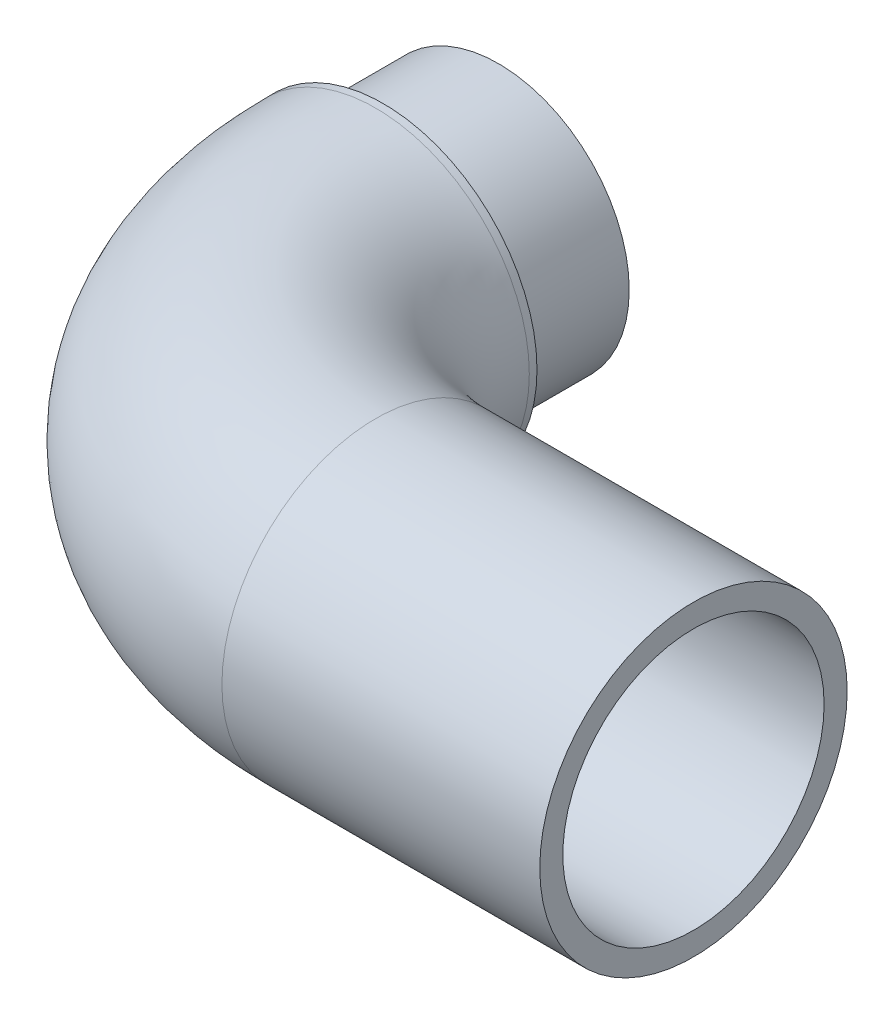
ISO-10303-21;
HEADER;
FILE_DESCRIPTION(('STEP AP214'),'2;1');
FILE_NAME('part.step','',(''),(''),'','','');
FILE_SCHEMA(('AUTOMOTIVE_DESIGN { 1 0 10303 214 1 1 1 1 }'));
ENDSEC;
DATA;
#1=APPLICATION_CONTEXT('core data for automotive mechanical design processes');
#2=APPLICATION_PROTOCOL_DEFINITION('international standard','automotive_design',2000,#1);
#3=PRODUCT_CONTEXT('',#1,'mechanical');
#4=PRODUCT('Part','Part','',(#3));
#5=PRODUCT_RELATED_PRODUCT_CATEGORY('part','',(#4));
#6=PRODUCT_DEFINITION_FORMATION('','',#4);
#7=PRODUCT_DEFINITION_CONTEXT('part definition',#1,'design');
#8=PRODUCT_DEFINITION('design','',#6,#7);
#9=PRODUCT_DEFINITION_SHAPE('','',#8);
#10=(LENGTH_UNIT() NAMED_UNIT(*) SI_UNIT(.MILLI.,.METRE.));
#11=(NAMED_UNIT(*) PLANE_ANGLE_UNIT() SI_UNIT($,.RADIAN.));
#12=(NAMED_UNIT(*) SI_UNIT($,.STERADIAN.) SOLID_ANGLE_UNIT());
#13=UNCERTAINTY_MEASURE_WITH_UNIT(LENGTH_MEASURE(1.E-05),#10,'distance_accuracy_value','');
#14=(GEOMETRIC_REPRESENTATION_CONTEXT(3) GLOBAL_UNCERTAINTY_ASSIGNED_CONTEXT((#13)) GLOBAL_UNIT_ASSIGNED_CONTEXT((#10,
#11,#12)) REPRESENTATION_CONTEXT('',''));
#15=CARTESIAN_POINT('',(0.,0.,0.));
#16=DIRECTION('',(0.,0.,1.));
#17=DIRECTION('',(1.,0.,0.));
#18=AXIS2_PLACEMENT_3D('',#15,#16,#17);
#19=CARTESIAN_POINT('',(0.,0.,15.));
#20=DIRECTION('',(0.,0.,-1.));
#21=DIRECTION('',(-1.,0.,0.));
#22=AXIS2_PLACEMENT_3D('',#19,#20,#21);
#23=CYLINDRICAL_SURFACE('',#22,17.);
#24=CARTESIAN_POINT('',(0.,0.,15.));
#25=DIRECTION('',(0.,0.,1.));
#26=DIRECTION('',(1.,0.,0.));
#27=AXIS2_PLACEMENT_3D('',#24,#25,#26);
#28=CIRCLE('',#27,17.);
#29=CARTESIAN_POINT('',(17.,0.,15.));
#30=VERTEX_POINT('',#29);
#31=EDGE_CURVE('E10',#30,#30,#28,.T.);
#32=ORIENTED_EDGE('',*,*,#31,.F.);
#33=EDGE_LOOP('',(#32));
#34=FACE_BOUND('',#33,.T.);
#35=CARTESIAN_POINT('',(0.,0.,0.));
#36=DIRECTION('',(0.,0.,1.));
#37=DIRECTION('',(1.,0.,0.));
#38=AXIS2_PLACEMENT_3D('',#35,#36,#37);
#39=CIRCLE('',#38,17.);
#40=CARTESIAN_POINT('',(17.,0.,0.));
#41=VERTEX_POINT('',#40);
#42=EDGE_CURVE('E36',#41,#41,#39,.T.);
#43=ORIENTED_EDGE('',*,*,#42,.T.);
#44=EDGE_LOOP('',(#43));
#45=FACE_BOUND('',#44,.T.);
#46=ADVANCED_FACE('F33',(#34,#45),#23,.T.);
#47=CARTESIAN_POINT('',(0.,0.,0.));
#48=DIRECTION('',(0.,0.,1.));
#49=DIRECTION('',(1.,0.,0.));
#50=AXIS2_PLACEMENT_3D('',#47,#48,#49);
#51=PLANE('',#50);
#52=ORIENTED_EDGE('',*,*,#42,.F.);
#53=EDGE_LOOP('',(#52));
#54=FACE_BOUND('',#53,.T.);
#55=ADVANCED_FACE('F93',(#54),#51,.F.);
#56=CARTESIAN_POINT('',(0.,0.,15.));
#57=DIRECTION('',(0.,0.,1.));
#58=DIRECTION('',(1.,0.,0.));
#59=AXIS2_PLACEMENT_3D('',#56,#57,#58);
#60=PLANE('',#59);
#61=ORIENTED_EDGE('',*,*,#31,.T.);
#62=EDGE_LOOP('',(#61));
#63=FACE_BOUND('',#62,.T.);
#64=CARTESIAN_POINT('',(0.,0.,15.));
#65=DIRECTION('',(0.,0.,1.));
#66=DIRECTION('',(1.,0.,0.));
#67=AXIS2_PLACEMENT_3D('',#64,#65,#66);
#68=CIRCLE('',#67,20.);
#69=CARTESIAN_POINT('',(20.,0.,15.));
#70=VERTEX_POINT('',#69);
#71=EDGE_CURVE('E53',#70,#70,#68,.T.);
#72=ORIENTED_EDGE('',*,*,#71,.F.);
#73=EDGE_LOOP('',(#72));
#74=FACE_BOUND('',#73,.T.);
#75=ADVANCED_FACE('F98',(#63,#74),#60,.F.);
#76=CARTESIAN_POINT('',(76.3607086726985,0.,51.));
#77=DIRECTION('',(1.,0.,0.));
#78=DIRECTION('',(0.,0.,-1.));
#79=AXIS2_PLACEMENT_3D('',#76,#77,#78);
#80=PLANE('',#79);
#81=CARTESIAN_POINT('',(76.3607086726985,0.,51.));
#82=DIRECTION('',(1.,0.,0.));
#83=DIRECTION('',(0.,0.,-1.));
#84=AXIS2_PLACEMENT_3D('',#81,#82,#83);
#85=CIRCLE('',#84,17.);
#86=CARTESIAN_POINT('',(76.3607086726985,0.,34.));
#87=VERTEX_POINT('',#86);
#88=EDGE_CURVE('E66',#87,#87,#85,.T.);
#89=ORIENTED_EDGE('',*,*,#88,.F.);
#90=EDGE_LOOP('',(#89));
#91=FACE_BOUND('',#90,.T.);
#92=CARTESIAN_POINT('',(76.3607086726985,0.,51.));
#93=DIRECTION('',(1.,0.,0.));
#94=DIRECTION('',(0.,0.,-1.));
#95=AXIS2_PLACEMENT_3D('',#92,#93,#94);
#96=CIRCLE('',#95,20.);
#97=CARTESIAN_POINT('',(76.3607086726985,0.,31.));
#98=VERTEX_POINT('',#97);
#99=EDGE_CURVE('E43',#98,#98,#96,.T.);
#100=ORIENTED_EDGE('',*,*,#99,.T.);
#101=EDGE_LOOP('',(#100));
#102=FACE_BOUND('',#101,.T.);
#103=ADVANCED_FACE('F106',(#91,#102),#80,.T.);
#104=CARTESIAN_POINT('',(0.,0.,15.));
#105=DIRECTION('',(0.,0.,1.));
#106=DIRECTION('',(1.,0.,0.));
#107=AXIS2_PLACEMENT_3D('',#104,#105,#106);
#108=CYLINDRICAL_SURFACE('',#107,20.);
#109=CARTESIAN_POINT('',(0.,0.,16.));
#110=DIRECTION('',(0.,0.,1.));
#111=DIRECTION('',(1.,0.,0.));
#112=AXIS2_PLACEMENT_3D('',#109,#110,#111);
#113=CIRCLE('',#112,20.);
#114=CARTESIAN_POINT('',(-20.,0.,16.));
#115=VERTEX_POINT('',#114);
#116=EDGE_CURVE('E50',#115,#115,#113,.T.);
#117=ORIENTED_EDGE('',*,*,#116,.F.);
#118=EDGE_LOOP('',(#117));
#119=FACE_BOUND('',#118,.T.);
#120=ORIENTED_EDGE('',*,*,#71,.T.);
#121=EDGE_LOOP('',(#120));
#122=FACE_BOUND('',#121,.T.);
#123=ADVANCED_FACE('F117',(#119,#122),#108,.T.);
#124=CARTESIAN_POINT('',(35.,0.,16.));
#125=DIRECTION('',(0.,1.,0.));
#126=DIRECTION('',(0.,0.,1.));
#127=AXIS2_PLACEMENT_3D('',#124,#125,#126);
#128=TOROIDAL_SURFACE('',#127,35.,20.);
#129=CARTESIAN_POINT('',(35.,0.,51.));
#130=DIRECTION('',(1.,0.,0.));
#131=DIRECTION('',(0.,0.,-1.));
#132=AXIS2_PLACEMENT_3D('',#129,#130,#131);
#133=CIRCLE('',#132,20.);
#134=CARTESIAN_POINT('',(35.,0.,71.));
#135=VERTEX_POINT('',#134);
#136=EDGE_CURVE('E47',#135,#135,#133,.T.);
#137=CARTESIAN_POINT('',(35.,0.,16.));
#138=DIRECTION('',(0.,1.,0.));
#139=DIRECTION('',(0.,0.,1.));
#140=AXIS2_PLACEMENT_3D('',#137,#138,#139);
#141=CIRCLE('',#140,55.);
#142=EDGE_CURVE('',#115,#135,#141,.T.);
#143=ORIENTED_EDGE('',*,*,#116,.T.);
#144=ORIENTED_EDGE('',*,*,#136,.F.);
#145=ORIENTED_EDGE('',*,*,#142,.T.);
#146=ORIENTED_EDGE('',*,*,#142,.F.);
#147=EDGE_LOOP('',(#143,#145,#144,#146));
#148=FACE_BOUND('',#147,.T.);
#149=ADVANCED_FACE('F109',(#148),#128,.T.);
#150=CARTESIAN_POINT('',(35.,0.,51.));
#151=DIRECTION('',(1.,0.,0.));
#152=DIRECTION('',(0.,0.,-1.));
#153=AXIS2_PLACEMENT_3D('',#150,#151,#152);
#154=CYLINDRICAL_SURFACE('',#153,20.);
#155=ORIENTED_EDGE('',*,*,#99,.F.);
#156=EDGE_LOOP('',(#155));
#157=FACE_BOUND('',#156,.T.);
#158=ORIENTED_EDGE('',*,*,#136,.T.);
#159=EDGE_LOOP('',(#158));
#160=FACE_BOUND('',#159,.T.);
#161=ADVANCED_FACE('F100',(#157,#160),#154,.T.);
#162=CARTESIAN_POINT('',(0.,0.,15.));
#163=DIRECTION('',(0.,0.,-1.));
#164=DIRECTION('',(-1.,0.,0.));
#165=AXIS2_PLACEMENT_3D('',#162,#163,#164);
#166=CYLINDRICAL_SURFACE('',#165,14.);
#167=CARTESIAN_POINT('',(0.,0.,18.));
#168=DIRECTION('',(0.,0.,1.));
#169=DIRECTION('',(1.,0.,0.));
#170=AXIS2_PLACEMENT_3D('',#167,#168,#169);
#171=CIRCLE('',#170,14.);
#172=CARTESIAN_POINT('',(14.,0.,18.));
#173=VERTEX_POINT('',#172);
#174=EDGE_CURVE('E56',#173,#173,#171,.T.);
#175=ORIENTED_EDGE('',*,*,#174,.T.);
#176=EDGE_LOOP('',(#175));
#177=FACE_BOUND('',#176,.T.);
#178=CARTESIAN_POINT('',(0.,0.,3.));
#179=DIRECTION('',(0.,0.,1.));
#180=DIRECTION('',(1.,0.,0.));
#181=AXIS2_PLACEMENT_3D('',#178,#179,#180);
#182=CIRCLE('',#181,14.);
#183=CARTESIAN_POINT('',(14.,0.,3.));
#184=VERTEX_POINT('',#183);
#185=EDGE_CURVE('E131',#184,#184,#182,.T.);
#186=ORIENTED_EDGE('',*,*,#185,.F.);
#187=EDGE_LOOP('',(#186));
#188=FACE_BOUND('',#187,.T.);
#189=ADVANCED_FACE('F90',(#177,#188),#166,.F.);
#190=CARTESIAN_POINT('',(0.,0.,3.));
#191=DIRECTION('',(0.,0.,1.));
#192=DIRECTION('',(1.,0.,0.));
#193=AXIS2_PLACEMENT_3D('',#190,#191,#192);
#194=PLANE('',#193);
#195=ORIENTED_EDGE('',*,*,#185,.T.);
#196=EDGE_LOOP('',(#195));
#197=FACE_BOUND('',#196,.T.);
#198=ADVANCED_FACE('F77',(#197),#194,.T.);
#199=CARTESIAN_POINT('',(0.,0.,18.));
#200=DIRECTION('',(0.,0.,1.));
#201=DIRECTION('',(1.,0.,0.));
#202=AXIS2_PLACEMENT_3D('',#199,#200,#201);
#203=PLANE('',#202);
#204=ORIENTED_EDGE('',*,*,#174,.F.);
#205=EDGE_LOOP('',(#204));
#206=FACE_BOUND('',#205,.T.);
#207=CARTESIAN_POINT('',(-10.6304352115561,-13.2310431459477,18.));
#208=CARTESIAN_POINT('',(-11.0022796488907,-12.9313478178478,18.));
#209=CARTESIAN_POINT('',(-11.3614449289228,-12.616016497693,18.));
#210=CARTESIAN_POINT('',(-12.0520844091158,-11.9561395098404,18.));
#211=CARTESIAN_POINT('',(-12.3835513717343,-11.6115862535754,18.));
#212=CARTESIAN_POINT('',(-13.0166237785163,-10.8954341590572,18.));
#213=CARTESIAN_POINT('',(-13.3181969768725,-10.5238068501056,18.));
#214=CARTESIAN_POINT('',(-13.8889742552831,-9.75639886922899,18.));
#215=CARTESIAN_POINT('',(-14.1581784710735,-9.36061829859853,18.));
#216=CARTESIAN_POINT('',(-14.5361435678762,-8.75115798258264,18.));
#217=CARTESIAN_POINT('',(-14.6578193872436,-8.54538411656839,18.));
#218=CARTESIAN_POINT('',(-14.892356743432,-8.12894229343867,18.));
#219=CARTESIAN_POINT('',(-15.0052205247882,-7.91827560044147,18.));
#220=CARTESIAN_POINT('',(-15.3303480218884,-7.27936798856905,18.));
#221=CARTESIAN_POINT('',(-15.5291678383327,-6.84418736309123,18.));
#222=CARTESIAN_POINT('',(-15.8893453762508,-5.95878435063019,18.));
#223=CARTESIAN_POINT('',(-16.0507125488799,-5.50856579133763,18.));
#224=CARTESIAN_POINT('',(-16.3349361174995,-4.59611741316506,18.));
#225=CARTESIAN_POINT('',(-16.4577926752204,-4.13388764473651,18.));
#226=CARTESIAN_POINT('',(-16.6640757408006,-3.20087112935778,18.));
#227=CARTESIAN_POINT('',(-16.7475148191758,-2.73008716020767,18.));
#228=CARTESIAN_POINT('',(-16.8744286985946,-1.78316134702246,18.));
#229=CARTESIAN_POINT('',(-16.9179034703545,-1.30701949906167,18.));
#230=CARTESIAN_POINT('',(-16.9645785835174,-0.352748601741941,18.));
#231=CARTESIAN_POINT('',(-16.9677774439148,0.12538052004534,18.));
#232=CARTESIAN_POINT('',(-16.9338742893181,1.08020775657851,18.));
#233=CARTESIAN_POINT('',(-16.8967722857268,1.55690587172925,18.));
#234=CARTESIAN_POINT('',(-16.7825465680271,2.50536010700927,18.));
#235=CARTESIAN_POINT('',(-16.7054329921555,2.97711744816763,18.));
#236=CARTESIAN_POINT('',(-16.5117398124711,3.91245927806366,18.));
#237=CARTESIAN_POINT('',(-16.3951602163935,4.37604376840314,18.));
#238=CARTESIAN_POINT('',(-16.12336645798,5.29174412967871,18.));
#239=CARTESIAN_POINT('',(-15.9681523886659,5.7438600282253,18.));
#240=CARTESIAN_POINT('',(-15.6201959106432,6.63341221985077,18.));
#241=CARTESIAN_POINT('',(-15.4274534962974,7.0708485107246,18.));
#242=CARTESIAN_POINT('',(-15.0057907144271,7.92798191068804,18.));
#243=CARTESIAN_POINT('',(-14.7768663740599,8.34767706534629,18.));
#244=CARTESIAN_POINT('',(-14.2844863025551,9.16629736751273,18.));
#245=CARTESIAN_POINT('',(-14.0210305721454,9.5652225154586,18.));
#246=CARTESIAN_POINT('',(-13.461464733903,10.33947195346,18.));
#247=CARTESIAN_POINT('',(-13.1653546629316,10.714796270156,18.));
#248=CARTESIAN_POINT('',(-12.5425883065919,11.4391837468995,18.));
#249=CARTESIAN_POINT('',(-12.2159320100499,11.7882468973406,18.));
#250=CARTESIAN_POINT('',(-11.5342406807144,12.4577942182799,18.));
#251=CARTESIAN_POINT('',(-11.1791926237872,12.7782651284059,18.));
#252=CARTESIAN_POINT('',(-10.4433769071685,13.3881776960252,18.));
#253=CARTESIAN_POINT('',(-10.0626092426942,13.6776193477483,18.));
#254=CARTESIAN_POINT('',(-9.27806233711038,14.223427770728,18.));
#255=CARTESIAN_POINT('',(-8.87428302747451,14.4797944434833,18.));
#256=CARTESIAN_POINT('',(-8.04658466642986,14.9576426907989,18.));
#257=CARTESIAN_POINT('',(-7.62266560274303,15.1791242440915,18.));
#258=CARTESIAN_POINT('',(-6.75733189951233,15.5858154006982,18.));
#259=CARTESIAN_POINT('',(-6.31590270944896,15.7709940443775,18.));
#260=CARTESIAN_POINT('',(-5.41902577477202,16.1035426707786,18.));
#261=CARTESIAN_POINT('',(-4.96357802424891,16.2509126375619,18.));
#262=CARTESIAN_POINT('',(-4.041897549714,16.5068127004189,18.));
#263=CARTESIAN_POINT('',(-3.57566479027623,16.6153426688939,18.));
#264=CARTESIAN_POINT('',(-2.63572377837702,16.7928077050484,18.));
#265=CARTESIAN_POINT('',(-2.16201551944854,16.8617427384725,18.));
#266=CARTESIAN_POINT('',(-1.20988104756663,16.9596068633864,18.));
#267=CARTESIAN_POINT('',(-0.731449641940243,16.9884854366926,18.));
#268=CARTESIAN_POINT('',(0.226146182570292,17.0058852202759,18.));
#269=CARTESIAN_POINT('',(0.705310601985062,16.9944064013245,18.));
#270=CARTESIAN_POINT('',(1.66097895744905,16.9311887697559,18.));
#271=CARTESIAN_POINT('',(2.13748287643687,16.8794496992536,18.));
#272=CARTESIAN_POINT('',(3.08445363113723,16.7360933236995,18.));
#273=CARTESIAN_POINT('',(3.55492046066623,16.6444759778055,18.));
#274=CARTESIAN_POINT('',(4.48721191736635,16.4218529810526,18.));
#275=CARTESIAN_POINT('',(4.94902202198328,16.2907865106504,18.));
#276=CARTESIAN_POINT('',(5.85997523253781,15.9902577624353,18.));
#277=CARTESIAN_POINT('',(6.30911832474283,15.8207954429985,18.));
#278=CARTESIAN_POINT('',(7.19155953975435,15.4446833815042,18.));
#279=CARTESIAN_POINT('',(7.62485750842329,15.2380332778087,18.));
#280=CARTESIAN_POINT('',(8.47253399160819,14.7890157806433,18.));
#281=CARTESIAN_POINT('',(8.88691249266004,14.5466483617557,18.));
#282=CARTESIAN_POINT('',(9.69431591577764,14.0275887154021,18.));
#283=CARTESIAN_POINT('',(10.0873135239905,13.7508539991604,18.));
#284=CARTESIAN_POINT('',(10.8485976288305,13.1652583802638,18.));
#285=CARTESIAN_POINT('',(11.2168840949222,12.8563974379121,18.));
#286=CARTESIAN_POINT('',(11.926117342115,12.2087298992702,18.));
#287=CARTESIAN_POINT('',(12.2670638879927,11.8699230453885,18.));
#288=CARTESIAN_POINT('',(12.9191656903449,11.1647589843901,18.));
#289=CARTESIAN_POINT('',(13.2303209725044,10.7984018010271,18.));
#290=CARTESIAN_POINT('',(13.82042718205,10.0409362121606,18.));
#291=CARTESIAN_POINT('',(14.0993959411428,9.64984169918178,18.));
#292=CARTESIAN_POINT('',(14.6232978725814,8.84548231454172,18.));
#293=CARTESIAN_POINT('',(14.8682310388131,8.43221743889789,18.));
#294=CARTESIAN_POINT('',(15.32225483562,7.58645564442218,18.));
#295=CARTESIAN_POINT('',(15.5313461736153,7.15395910538329,18.));
#296=CARTESIAN_POINT('',(15.9121350070267,6.27280575662038,18.));
#297=CARTESIAN_POINT('',(16.0838326404496,5.82414900654507,18.));
#298=CARTESIAN_POINT('',(16.3879274921767,4.9157162330063,18.));
#299=CARTESIAN_POINT('',(16.5204800282515,4.45599220019979,18.));
#300=CARTESIAN_POINT('',(16.7462061663003,3.52697533426119,18.));
#301=CARTESIAN_POINT('',(16.8393798708713,3.05768252606278,18.));
#302=CARTESIAN_POINT('',(16.9856340816018,2.11290642460681,18.));
#303=CARTESIAN_POINT('',(17.0387159760232,1.63742334628019,18.));
#304=CARTESIAN_POINT('',(17.1043832271779,0.683669336444491,18.));
#305=CARTESIAN_POINT('',(17.116968719118,0.205398414248646,18.));
#306=CARTESIAN_POINT('',(17.1015869435315,-0.747992799018753,18.));
#307=CARTESIAN_POINT('',(17.0738308609913,-1.22311651143864,18.));
#308=CARTESIAN_POINT('',(16.9783604845061,-2.16933046263167,18.));
#309=CARTESIAN_POINT('',(16.910646341284,-2.64042071661233,18.));
#310=CARTESIAN_POINT('',(16.7357742849943,-3.57522185088266,18.));
#311=CARTESIAN_POINT('',(16.6286163165965,-4.03893272081989,18.));
#312=CARTESIAN_POINT('',(16.3756639054893,-4.95569329682459,18.));
#313=CARTESIAN_POINT('',(16.2298693903275,-5.40874298289813,18.));
#314=CARTESIAN_POINT('',(15.9007164003447,-6.30102817269421,18.));
#315=CARTESIAN_POINT('',(15.717354633134,-6.74026246174235,18.));
#316=CARTESIAN_POINT('',(15.3144260624769,-7.60179610998041,18.));
#317=CARTESIAN_POINT('',(15.0948592834463,-8.02409548059055,18.));
#318=CARTESIAN_POINT('',(14.6211131678344,-8.84882275448038,18.));
#319=CARTESIAN_POINT('',(14.3669330399589,-9.25125020318218,18.));
#320=CARTESIAN_POINT('',(13.8257930113018,-10.0334267339672,18.));
#321=CARTESIAN_POINT('',(13.5388329731583,-10.4131757210079,18.));
#322=CARTESIAN_POINT('',(12.9325964531962,-11.1492816059568,18.));
#323=CARTESIAN_POINT('',(12.6131588583701,-11.505505825291,18.));
#324=CARTESIAN_POINT('',(11.9455089553378,-12.1898827422378,18.));
#325=CARTESIAN_POINT('',(11.5972965584834,-12.5180353533623,18.));
#326=CARTESIAN_POINT('',(10.8745639813028,-13.1439772419294,18.));
#327=CARTESIAN_POINT('',(10.5000433391738,-13.4417659861537,18.));
#328=CARTESIAN_POINT('',(9.72734837210483,-14.0048867214546,18.));
#329=CARTESIAN_POINT('',(9.32917400398439,-14.2702186532779,18.));
#330=CARTESIAN_POINT('',(8.51035235055674,-14.7675502813962,18.));
#331=CARTESIAN_POINT('',(8.08962195068788,-14.9994131499001,18.));
#332=CARTESIAN_POINT('',(7.2301350233749,-15.4268984090964,18.));
#333=CARTESIAN_POINT('',(6.79137843999339,-15.6225206873195,18.));
#334=CARTESIAN_POINT('',(5.89896709733196,-15.9761239355519,18.));
#335=CARTESIAN_POINT('',(5.44531283735579,-16.1341061656259,18.));
#336=CARTESIAN_POINT('',(4.52631335996041,-16.4113059369345,18.));
#337=CARTESIAN_POINT('',(4.06096816061168,-16.530523538083,18.));
#338=CARTESIAN_POINT('',(3.12167429900974,-16.7293784079808,18.));
#339=CARTESIAN_POINT('',(2.64772189033603,-16.8089979912662,18.));
#340=CARTESIAN_POINT('',(1.69480619081124,-16.9279976851484,18.));
#341=CARTESIAN_POINT('',(1.21584287657948,-16.967377607904,18.));
#342=CARTESIAN_POINT('',(0.256117208174133,-17.0055985772481,18.));
#343=CARTESIAN_POINT('',(-0.224645568235189,-17.0044294239262,18.));
#344=CARTESIAN_POINT('',(-0.944271939316785,-16.9722654736421,18.));
#345=CARTESIAN_POINT('',(-1.18390373373029,-16.9564745795892,18.));
#346=CARTESIAN_POINT('',(-1.6623497203192,-16.9147833896631,18.));
#347=CARTESIAN_POINT('',(-1.90116368681449,-16.8888804996278,18.));
#348=CARTESIAN_POINT('',(-2.61519299343956,-16.7961187565706,18.));
#349=CARTESIAN_POINT('',(-3.08853027515943,-16.7141828632396,18.));
#350=CARTESIAN_POINT('',(-4.02659948380614,-16.5106408563862,18.));
#351=CARTESIAN_POINT('',(-4.4913313933532,-16.3890346627534,18.));
#352=CARTESIAN_POINT('',(-5.17916819985964,-16.17763450804,18.));
#353=CARTESIAN_POINT('',(-5.40682285171296,-16.1023684799822,18.));
#354=CARTESIAN_POINT('',(-5.85869285316105,-15.9423159777542,18.));
#355=CARTESIAN_POINT('',(-6.08290911437253,-15.8575320784413,18.));
#356=CARTESIAN_POINT('',(-6.74979709904822,-15.5891245401735,18.));
#357=CARTESIAN_POINT('',(-7.18686977998325,-15.3913953215151,18.));
#358=CARTESIAN_POINT('',(-8.14977329734414,-14.9057824907347,18.));
#359=CARTESIAN_POINT('',(-8.67048869905121,-14.6077175478471,18.));
#360=CARTESIAN_POINT('',(-9.67759812477425,-13.9583173168317,18.));
#361=CARTESIAN_POINT('',(-10.1639921766229,-13.6069820719037,18.));
#362=CARTESIAN_POINT('',(-10.6304352115561,-13.2310431459477,18.));
#363=B_SPLINE_CURVE_WITH_KNOTS('',3,(#207,#208,#209,#210,#211,#212,#213,#214,#215,#216,#217,
#218,#219,#220,#221,#222,#223,#224,#225,#226,#227,#228,#229,#230,#231,#232,#233,#234,#235,#236,
#237,#238,#239,#240,#241,#242,#243,#244,#245,#246,#247,#248,#249,#250,#251,#252,#253,#254,#255,
#256,#257,#258,#259,#260,#261,#262,#263,#264,#265,#266,#267,#268,#269,#270,#271,#272,#273,#274,
#275,#276,#277,#278,#279,#280,#281,#282,#283,#284,#285,#286,#287,#288,#289,#290,#291,#292,#293,
#294,#295,#296,#297,#298,#299,#300,#301,#302,#303,#304,#305,#306,#307,#308,#309,#310,#311,#312,
#313,#314,#315,#316,#317,#318,#319,#320,#321,#322,#323,#324,#325,#326,#327,#328,#329,#330,#331,
#332,#333,#334,#335,#336,#337,#338,#339,#340,#341,#342,#343,#344,#345,#346,#347,#348,#349,#350,
#351,#352,#353,#354,#355,#356,#357,#358,#359,#360,#361,#362),.UNSPECIFIED.,.T.,.F.,(4,2,2,2,2,2,
2,2,2,2,2,2,2,2,2,2,2,2,2,2,2,2,2,2,2,2,2,2,2,2,2,2,2,2,2,2,2,2,2,2,2,2,2,2,2,2,2,2,2,2,2,2,2,2,
2,2,2,2,2,2,2,2,2,2,2,2,2,2,2,2,2,2,2,2,2,2,2,4),(0.,1.43222421983682,2.86482151574482,
4.29894768331736,5.73306783682432,6.45005309159337,7.16685512148851,8.60034597922558,
10.0334747020217,11.4665974061274,12.8992627681117,14.3319291798692,15.7646482727589,
17.1973669602753,18.6297227989399,20.0620783568709,21.4944304660947,22.926782790475,
24.3592924992095,25.7918021777565,27.2243102392624,28.6568188247773,30.0899883558121,
31.523158153358,32.9563322189592,34.3895071582953,35.8238990627986,37.2582915719786,
38.6926887934368,40.12708725586,41.5632931051697,42.9994999946376,44.4357160837342,
45.8719336437686,47.3103768922579,48.7488217001357,50.1872804971401,51.6257403178138,
53.0659965693225,54.5062546005098,55.9465250218534,57.3867942014316,58.8262615843265,
60.2657292258049,61.7051684528336,63.1446023673153,64.5782457790621,66.0118854555921,
67.4454754871071,68.879060732236,70.3051682476935,71.7312703838706,73.1573745205339,
74.5834813314919,76.0097131797928,77.4359440662843,78.8622075632586,80.2884770371091,
81.7222033312676,83.1559340425554,84.5896899271793,86.0234484292325,87.4629117743956,
88.9023795867222,90.3417992036407,91.7812165958093,93.2212762917035,94.6613427098555,
96.1017713718976,96.8220418074183,97.5424971448609,98.9818078435508,100.421121448818,
101.140257547545,101.859199566018,103.296577581405,105.093166387069,106.889753735785),.UNSPECIFIED.);
#364=CARTESIAN_POINT('',(-10.6304352115561,-13.2310431459477,18.));
#365=VERTEX_POINT('',#364);
#366=EDGE_CURVE('E57',#365,#365,#363,.F.);
#367=ORIENTED_EDGE('',*,*,#366,.T.);
#368=EDGE_LOOP('',(#367));
#369=FACE_BOUND('',#368,.T.);
#370=ADVANCED_FACE('F71',(#206,#369),#203,.T.);
#371=CARTESIAN_POINT('',(35.,0.,16.));
#372=DIRECTION('',(0.,1.,0.));
#373=DIRECTION('',(0.,0.,1.));
#374=AXIS2_PLACEMENT_3D('',#371,#372,#373);
#375=TOROIDAL_SURFACE('',#374,35.,17.);
#376=CARTESIAN_POINT('',(35.,0.,51.));
#377=DIRECTION('',(1.,0.,0.));
#378=DIRECTION('',(0.,0.,-1.));
#379=AXIS2_PLACEMENT_3D('',#376,#377,#378);
#380=CIRCLE('',#379,17.);
#381=CARTESIAN_POINT('',(35.,0.,34.));
#382=VERTEX_POINT('',#381);
#383=EDGE_CURVE('E65',#382,#382,#380,.T.);
#384=ORIENTED_EDGE('',*,*,#383,.T.);
#385=EDGE_LOOP('',(#384));
#386=FACE_BOUND('',#385,.T.);
#387=ORIENTED_EDGE('',*,*,#366,.F.);
#388=EDGE_LOOP('',(#387));
#389=FACE_BOUND('',#388,.T.);
#390=ADVANCED_FACE('F76',(#386,#389),#375,.F.);
#391=CARTESIAN_POINT('',(35.,0.,51.));
#392=DIRECTION('',(1.,0.,0.));
#393=DIRECTION('',(0.,0.,-1.));
#394=AXIS2_PLACEMENT_3D('',#391,#392,#393);
#395=CYLINDRICAL_SURFACE('',#394,17.);
#396=ORIENTED_EDGE('',*,*,#88,.T.);
#397=EDGE_LOOP('',(#396));
#398=FACE_BOUND('',#397,.T.);
#399=ORIENTED_EDGE('',*,*,#383,.F.);
#400=EDGE_LOOP('',(#399));
#401=FACE_BOUND('',#400,.T.);
#402=ADVANCED_FACE('F81',(#398,#401),#395,.F.);
#403=CLOSED_SHELL('',(#46,#55,#75,#103,#123,#149,#161,#189,#198,#370,#390,#402));
#404=MANIFOLD_SOLID_BREP('B2',#403);
#405=ADVANCED_BREP_SHAPE_REPRESENTATION('',(#18,#404),#14);
#406=SHAPE_DEFINITION_REPRESENTATION(#9,#405);
ENDSEC;
END-ISO-10303-21;
